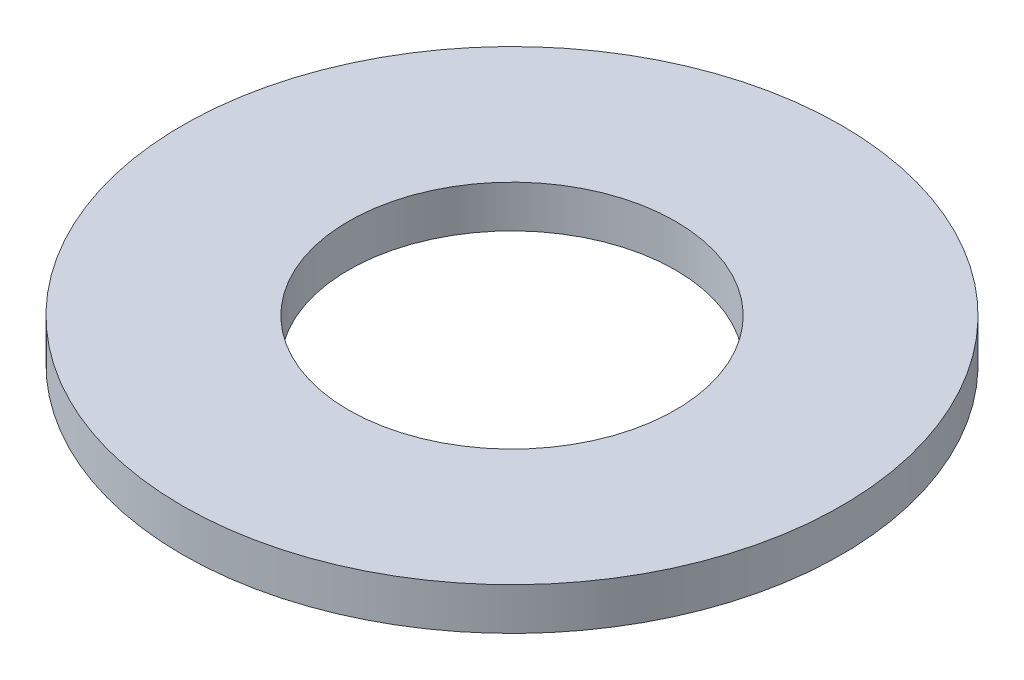
ISO-10303-21;
HEADER;
FILE_DESCRIPTION(('STEP AP214'),'2;1');
FILE_NAME('part.step','',(''),(''),'','','');
FILE_SCHEMA(('AUTOMOTIVE_DESIGN { 1 0 10303 214 1 1 1 1 }'));
ENDSEC;
DATA;
#1=APPLICATION_CONTEXT('core data for automotive mechanical design processes');
#2=APPLICATION_PROTOCOL_DEFINITION('international standard','automotive_design',2000,#1);
#3=PRODUCT_CONTEXT('',#1,'mechanical');
#4=PRODUCT('Part','Part','',(#3));
#5=PRODUCT_RELATED_PRODUCT_CATEGORY('part','',(#4));
#6=PRODUCT_DEFINITION_FORMATION('','',#4);
#7=PRODUCT_DEFINITION_CONTEXT('part definition',#1,'design');
#8=PRODUCT_DEFINITION('design','',#6,#7);
#9=PRODUCT_DEFINITION_SHAPE('','',#8);
#10=(LENGTH_UNIT() NAMED_UNIT(*) SI_UNIT(.MILLI.,.METRE.));
#11=(NAMED_UNIT(*) PLANE_ANGLE_UNIT() SI_UNIT($,.RADIAN.));
#12=(NAMED_UNIT(*) SI_UNIT($,.STERADIAN.) SOLID_ANGLE_UNIT());
#13=UNCERTAINTY_MEASURE_WITH_UNIT(LENGTH_MEASURE(1.E-05),#10,'distance_accuracy_value','');
#14=(GEOMETRIC_REPRESENTATION_CONTEXT(3) GLOBAL_UNCERTAINTY_ASSIGNED_CONTEXT((#13)) GLOBAL_UNIT_ASSIGNED_CONTEXT((#10,
#11,#12)) REPRESENTATION_CONTEXT('',''));
#15=CARTESIAN_POINT('',(0.,0.,0.));
#16=DIRECTION('',(0.,0.,1.));
#17=DIRECTION('',(1.,0.,0.));
#18=AXIS2_PLACEMENT_3D('',#15,#16,#17);
#19=CARTESIAN_POINT('',(0.,0.82,0.));
#20=DIRECTION('',(0.,1.,0.));
#21=DIRECTION('',(0.,0.,1.));
#22=AXIS2_PLACEMENT_3D('',#19,#20,#21);
#23=PLANE('',#22);
#24=CARTESIAN_POINT('',(0.,0.82,0.));
#25=DIRECTION('',(0.,1.,0.));
#26=DIRECTION('',(0.,0.,1.));
#27=AXIS2_PLACEMENT_3D('',#24,#25,#26);
#28=CIRCLE('',#27,6.4);
#29=CARTESIAN_POINT('',(0.,0.82,6.4));
#30=VERTEX_POINT('',#29);
#31=EDGE_CURVE('E10',#30,#30,#28,.T.);
#32=ORIENTED_EDGE('',*,*,#31,.T.);
#33=EDGE_LOOP('',(#32));
#34=FACE_BOUND('',#33,.T.);
#35=CARTESIAN_POINT('',(0.,0.82,0.));
#36=DIRECTION('',(0.,1.,0.));
#37=DIRECTION('',(0.,0.,1.));
#38=AXIS2_PLACEMENT_3D('',#35,#36,#37);
#39=CIRCLE('',#38,3.175);
#40=CARTESIAN_POINT('',(0.,0.82,3.175));
#41=VERTEX_POINT('',#40);
#42=EDGE_CURVE('E55',#41,#41,#39,.T.);
#43=ORIENTED_EDGE('',*,*,#42,.F.);
#44=EDGE_LOOP('',(#43));
#45=FACE_BOUND('',#44,.T.);
#46=ADVANCED_FACE('F41',(#34,#45),#23,.T.);
#47=CARTESIAN_POINT('',(0.,0.,0.));
#48=DIRECTION('',(0.,1.,0.));
#49=DIRECTION('',(0.,0.,1.));
#50=AXIS2_PLACEMENT_3D('',#47,#48,#49);
#51=PLANE('',#50);
#52=CARTESIAN_POINT('',(0.,0.,0.));
#53=DIRECTION('',(0.,1.,0.));
#54=DIRECTION('',(0.,0.,1.));
#55=AXIS2_PLACEMENT_3D('',#52,#53,#54);
#56=CIRCLE('',#55,6.4);
#57=CARTESIAN_POINT('',(0.,0.,6.4));
#58=VERTEX_POINT('',#57);
#59=EDGE_CURVE('E44',#58,#58,#56,.T.);
#60=ORIENTED_EDGE('',*,*,#59,.F.);
#61=EDGE_LOOP('',(#60));
#62=FACE_BOUND('',#61,.T.);
#63=CARTESIAN_POINT('',(0.,0.,0.));
#64=DIRECTION('',(0.,1.,0.));
#65=DIRECTION('',(0.,0.,1.));
#66=AXIS2_PLACEMENT_3D('',#63,#64,#65);
#67=CIRCLE('',#66,3.175);
#68=CARTESIAN_POINT('',(0.,0.,3.175));
#69=VERTEX_POINT('',#68);
#70=EDGE_CURVE('E53',#69,#69,#67,.T.);
#71=ORIENTED_EDGE('',*,*,#70,.T.);
#72=EDGE_LOOP('',(#71));
#73=FACE_BOUND('',#72,.T.);
#74=ADVANCED_FACE('F63',(#62,#73),#51,.F.);
#75=CARTESIAN_POINT('',(0.,0.82,0.));
#76=DIRECTION('',(0.,-1.,0.));
#77=DIRECTION('',(0.,0.,-1.));
#78=AXIS2_PLACEMENT_3D('',#75,#76,#77);
#79=CYLINDRICAL_SURFACE('',#78,6.4);
#80=ORIENTED_EDGE('',*,*,#31,.F.);
#81=EDGE_LOOP('',(#80));
#82=FACE_BOUND('',#81,.T.);
#83=ORIENTED_EDGE('',*,*,#59,.T.);
#84=EDGE_LOOP('',(#83));
#85=FACE_BOUND('',#84,.T.);
#86=ADVANCED_FACE('F43',(#82,#85),#79,.T.);
#87=CARTESIAN_POINT('',(0.,0.82,0.));
#88=DIRECTION('',(0.,-1.,0.));
#89=DIRECTION('',(0.,0.,-1.));
#90=AXIS2_PLACEMENT_3D('',#87,#88,#89);
#91=CYLINDRICAL_SURFACE('',#90,3.175);
#92=ORIENTED_EDGE('',*,*,#42,.T.);
#93=EDGE_LOOP('',(#92));
#94=FACE_BOUND('',#93,.T.);
#95=ORIENTED_EDGE('',*,*,#70,.F.);
#96=EDGE_LOOP('',(#95));
#97=FACE_BOUND('',#96,.T.);
#98=ADVANCED_FACE('F58',(#94,#97),#91,.F.);
#99=CLOSED_SHELL('',(#46,#74,#86,#98));
#100=MANIFOLD_SOLID_BREP('B2',#99);
#101=ADVANCED_BREP_SHAPE_REPRESENTATION('',(#18,#100),#14);
#102=SHAPE_DEFINITION_REPRESENTATION(#9,#101);
ENDSEC;
END-ISO-10303-21;
